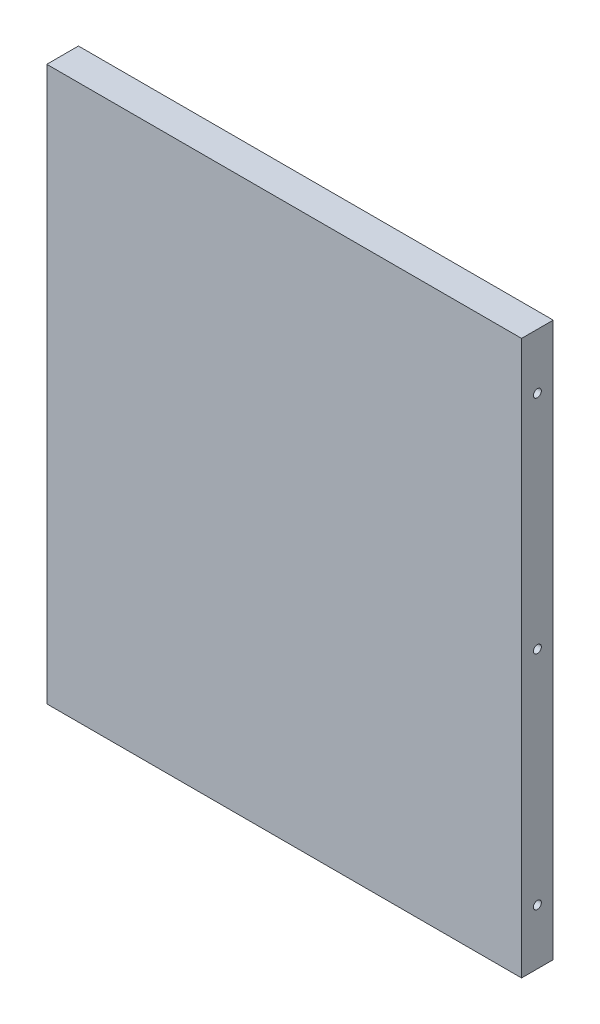
ISO-10303-21;
HEADER;
FILE_DESCRIPTION(('STEP AP214'),'2;1');
FILE_NAME('part.step','',(''),(''),'','','');
FILE_SCHEMA(('AUTOMOTIVE_DESIGN { 1 0 10303 214 1 1 1 1 }'));
ENDSEC;
DATA;
#1=APPLICATION_CONTEXT('core data for automotive mechanical design processes');
#2=APPLICATION_PROTOCOL_DEFINITION('international standard','automotive_design',2000,#1);
#3=PRODUCT_CONTEXT('',#1,'mechanical');
#4=PRODUCT('Part','Part','',(#3));
#5=PRODUCT_RELATED_PRODUCT_CATEGORY('part','',(#4));
#6=PRODUCT_DEFINITION_FORMATION('','',#4);
#7=PRODUCT_DEFINITION_CONTEXT('part definition',#1,'design');
#8=PRODUCT_DEFINITION('design','',#6,#7);
#9=PRODUCT_DEFINITION_SHAPE('','',#8);
#10=(LENGTH_UNIT() NAMED_UNIT(*) SI_UNIT(.MILLI.,.METRE.));
#11=(NAMED_UNIT(*) PLANE_ANGLE_UNIT() SI_UNIT($,.RADIAN.));
#12=(NAMED_UNIT(*) SI_UNIT($,.STERADIAN.) SOLID_ANGLE_UNIT());
#13=UNCERTAINTY_MEASURE_WITH_UNIT(LENGTH_MEASURE(1.E-05),#10,'distance_accuracy_value','');
#14=(GEOMETRIC_REPRESENTATION_CONTEXT(3) GLOBAL_UNCERTAINTY_ASSIGNED_CONTEXT((#13)) GLOBAL_UNIT_ASSIGNED_CONTEXT((#10,
#11,#12)) REPRESENTATION_CONTEXT('',''));
#15=CARTESIAN_POINT('',(0.,0.,0.));
#16=DIRECTION('',(0.,0.,1.));
#17=DIRECTION('',(1.,0.,0.));
#18=AXIS2_PLACEMENT_3D('',#15,#16,#17);
#19=CARTESIAN_POINT('',(-84.7009024495058,65.5769230769231,10.));
#20=DIRECTION('',(1.,0.,0.));
#21=DIRECTION('',(0.,1.,0.));
#22=AXIS2_PLACEMENT_3D('',#19,#20,#21);
#23=PLANE('',#22);
#24=CARTESIAN_POINT('',(-84.7009024495058,48.0769230769231,4.99999999999999));
#25=DIRECTION('',(-1.,0.,0.));
#26=DIRECTION('',(0.,-1.,0.));
#27=AXIS2_PLACEMENT_3D('',#24,#25,#26);
#28=CIRCLE('',#27,1.25);
#29=CARTESIAN_POINT('',(-84.7009024495058,46.8269230769231,4.99999999999999));
#30=VERTEX_POINT('',#29);
#31=EDGE_CURVE('E122',#30,#30,#28,.T.);
#32=ORIENTED_EDGE('',*,*,#31,.F.);
#33=EDGE_LOOP('',(#32));
#34=FACE_BOUND('',#33,.T.);
#35=CARTESIAN_POINT('',(-84.7009024495058,-21.9230769230769,5.));
#36=DIRECTION('',(-1.,0.,0.));
#37=DIRECTION('',(0.,-1.,0.));
#38=AXIS2_PLACEMENT_3D('',#35,#36,#37);
#39=CIRCLE('',#38,1.25);
#40=CARTESIAN_POINT('',(-84.7009024495058,-23.1730769230769,5.));
#41=VERTEX_POINT('',#40);
#42=EDGE_CURVE('E116',#41,#41,#39,.T.);
#43=ORIENTED_EDGE('',*,*,#42,.F.);
#44=EDGE_LOOP('',(#43));
#45=FACE_BOUND('',#44,.T.);
#46=CARTESIAN_POINT('',(-84.7009024495058,-91.9230769230769,4.99999999999999));
#47=DIRECTION('',(-1.,0.,0.));
#48=DIRECTION('',(0.,-1.,0.));
#49=AXIS2_PLACEMENT_3D('',#46,#47,#48);
#50=CIRCLE('',#49,1.25);
#51=CARTESIAN_POINT('',(-84.7009024495058,-93.1730769230769,4.99999999999999));
#52=VERTEX_POINT('',#51);
#53=EDGE_CURVE('E109',#52,#52,#50,.T.);
#54=ORIENTED_EDGE('',*,*,#53,.F.);
#55=EDGE_LOOP('',(#54));
#56=FACE_BOUND('',#55,.T.);
#57=DIRECTION('',(0.,-1.,0.));
#58=VECTOR('',#57,1.);
#59=CARTESIAN_POINT('',(-84.7009024495058,65.5769230769231,0.));
#60=LINE('',#59,#58);
#61=CARTESIAN_POINT('',(-84.7009024495058,65.5769230769231,0.));
#62=VERTEX_POINT('',#61);
#63=CARTESIAN_POINT('',(-84.7009024495058,-109.423076923077,0.));
#64=VERTEX_POINT('',#63);
#65=EDGE_CURVE('E95',#62,#64,#60,.T.);
#66=ORIENTED_EDGE('',*,*,#65,.T.);
#67=DIRECTION('',(0.,0.,-1.));
#68=VECTOR('',#67,1.);
#69=CARTESIAN_POINT('',(-84.7009024495058,-109.423076923077,10.));
#70=LINE('',#69,#68);
#71=CARTESIAN_POINT('',(-84.7009024495058,-109.423076923077,10.));
#72=VERTEX_POINT('',#71);
#73=EDGE_CURVE('E11',#72,#64,#70,.T.);
#74=ORIENTED_EDGE('',*,*,#73,.F.);
#75=DIRECTION('',(0.,-1.,0.));
#76=VECTOR('',#75,1.);
#77=CARTESIAN_POINT('',(-84.7009024495058,65.5769230769231,10.));
#78=LINE('',#77,#76);
#79=CARTESIAN_POINT('',(-84.7009024495058,65.5769230769231,10.));
#80=VERTEX_POINT('',#79);
#81=EDGE_CURVE('E83',#80,#72,#78,.T.);
#82=ORIENTED_EDGE('',*,*,#81,.F.);
#83=DIRECTION('',(0.,0.,-1.));
#84=VECTOR('',#83,1.);
#85=CARTESIAN_POINT('',(-84.7009024495058,65.5769230769231,10.));
#86=LINE('',#85,#84);
#87=EDGE_CURVE('E91',#80,#62,#86,.T.);
#88=ORIENTED_EDGE('',*,*,#87,.T.);
#89=EDGE_LOOP('',(#66,#74,#82,#88));
#90=FACE_BOUND('',#89,.T.);
#91=ADVANCED_FACE('F32',(#34,#45,#56,#90),#23,.F.);
#92=CARTESIAN_POINT('',(-84.7009024495058,-109.423076923077,10.));
#93=DIRECTION('',(0.,1.,0.));
#94=DIRECTION('',(0.,0.,1.));
#95=AXIS2_PLACEMENT_3D('',#92,#93,#94);
#96=PLANE('',#95);
#97=DIRECTION('',(1.,0.,0.));
#98=VECTOR('',#97,1.);
#99=CARTESIAN_POINT('',(-84.7009024495058,-109.423076923077,0.));
#100=LINE('',#99,#98);
#101=CARTESIAN_POINT('',(65.2990975504942,-109.423076923077,0.));
#102=VERTEX_POINT('',#101);
#103=EDGE_CURVE('E87',#64,#102,#100,.T.);
#104=ORIENTED_EDGE('',*,*,#103,.T.);
#105=DIRECTION('',(0.,0.,-1.));
#106=VECTOR('',#105,1.);
#107=CARTESIAN_POINT('',(65.2990975504942,-109.423076923077,10.));
#108=LINE('',#107,#106);
#109=CARTESIAN_POINT('',(65.2990975504942,-109.423076923077,10.));
#110=VERTEX_POINT('',#109);
#111=EDGE_CURVE('E40',#110,#102,#108,.T.);
#112=ORIENTED_EDGE('',*,*,#111,.F.);
#113=DIRECTION('',(1.,0.,0.));
#114=VECTOR('',#113,1.);
#115=CARTESIAN_POINT('',(-84.7009024495058,-109.423076923077,10.));
#116=LINE('',#115,#114);
#117=EDGE_CURVE('E78',#72,#110,#116,.T.);
#118=ORIENTED_EDGE('',*,*,#117,.F.);
#119=ORIENTED_EDGE('',*,*,#73,.T.);
#120=EDGE_LOOP('',(#104,#112,#118,#119));
#121=FACE_BOUND('',#120,.T.);
#122=ADVANCED_FACE('F86',(#121),#96,.F.);
#123=CARTESIAN_POINT('',(65.2990975504942,65.5769230769231,10.));
#124=DIRECTION('',(-1.,0.,0.));
#125=DIRECTION('',(0.,-1.,0.));
#126=AXIS2_PLACEMENT_3D('',#123,#124,#125);
#127=PLANE('',#126);
#128=CARTESIAN_POINT('',(65.2990975504942,48.0769230769231,5.));
#129=DIRECTION('',(1.,0.,0.));
#130=DIRECTION('',(0.,1.,0.));
#131=AXIS2_PLACEMENT_3D('',#128,#129,#130);
#132=CIRCLE('',#131,1.25);
#133=CARTESIAN_POINT('',(65.2990975504942,49.3269230769231,5.));
#134=VERTEX_POINT('',#133);
#135=EDGE_CURVE('E139',#134,#134,#132,.T.);
#136=ORIENTED_EDGE('',*,*,#135,.F.);
#137=EDGE_LOOP('',(#136));
#138=FACE_BOUND('',#137,.T.);
#139=CARTESIAN_POINT('',(65.2990975504942,-21.9230769230769,5.));
#140=DIRECTION('',(1.,0.,0.));
#141=DIRECTION('',(0.,1.,0.));
#142=AXIS2_PLACEMENT_3D('',#139,#140,#141);
#143=CIRCLE('',#142,1.25);
#144=CARTESIAN_POINT('',(65.2990975504942,-20.6730769230769,5.));
#145=VERTEX_POINT('',#144);
#146=EDGE_CURVE('E133',#145,#145,#143,.T.);
#147=ORIENTED_EDGE('',*,*,#146,.F.);
#148=EDGE_LOOP('',(#147));
#149=FACE_BOUND('',#148,.T.);
#150=CARTESIAN_POINT('',(65.2990975504942,-91.9230769230769,5.));
#151=DIRECTION('',(1.,0.,0.));
#152=DIRECTION('',(0.,1.,0.));
#153=AXIS2_PLACEMENT_3D('',#150,#151,#152);
#154=CIRCLE('',#153,1.25);
#155=CARTESIAN_POINT('',(65.2990975504942,-90.6730769230769,5.));
#156=VERTEX_POINT('',#155);
#157=EDGE_CURVE('E127',#156,#156,#154,.T.);
#158=ORIENTED_EDGE('',*,*,#157,.F.);
#159=EDGE_LOOP('',(#158));
#160=FACE_BOUND('',#159,.T.);
#161=DIRECTION('',(0.,1.,0.));
#162=VECTOR('',#161,1.);
#163=CARTESIAN_POINT('',(65.2990975504942,65.5769230769231,0.));
#164=LINE('',#163,#162);
#165=CARTESIAN_POINT('',(65.2990975504942,65.5769230769231,0.));
#166=VERTEX_POINT('',#165);
#167=EDGE_CURVE('E65',#102,#166,#164,.T.);
#168=ORIENTED_EDGE('',*,*,#167,.T.);
#169=DIRECTION('',(0.,0.,-1.));
#170=VECTOR('',#169,1.);
#171=CARTESIAN_POINT('',(65.2990975504942,65.5769230769231,10.));
#172=LINE('',#171,#170);
#173=CARTESIAN_POINT('',(65.2990975504942,65.5769230769231,10.));
#174=VERTEX_POINT('',#173);
#175=EDGE_CURVE('E88',#174,#166,#172,.T.);
#176=ORIENTED_EDGE('',*,*,#175,.F.);
#177=DIRECTION('',(0.,1.,0.));
#178=VECTOR('',#177,1.);
#179=CARTESIAN_POINT('',(65.2990975504942,65.5769230769231,10.));
#180=LINE('',#179,#178);
#181=EDGE_CURVE('E81',#110,#174,#180,.T.);
#182=ORIENTED_EDGE('',*,*,#181,.F.);
#183=ORIENTED_EDGE('',*,*,#111,.T.);
#184=EDGE_LOOP('',(#168,#176,#182,#183));
#185=FACE_BOUND('',#184,.T.);
#186=ADVANCED_FACE('F89',(#138,#149,#160,#185),#127,.F.);
#187=CARTESIAN_POINT('',(-84.7009024495058,65.5769230769231,10.));
#188=DIRECTION('',(0.,-1.,0.));
#189=DIRECTION('',(0.,0.,-1.));
#190=AXIS2_PLACEMENT_3D('',#187,#188,#189);
#191=PLANE('',#190);
#192=DIRECTION('',(-1.,0.,0.));
#193=VECTOR('',#192,1.);
#194=CARTESIAN_POINT('',(-84.7009024495058,65.5769230769231,0.));
#195=LINE('',#194,#193);
#196=EDGE_CURVE('E71',#166,#62,#195,.T.);
#197=ORIENTED_EDGE('',*,*,#196,.T.);
#198=ORIENTED_EDGE('',*,*,#87,.F.);
#199=DIRECTION('',(-1.,0.,0.));
#200=VECTOR('',#199,1.);
#201=CARTESIAN_POINT('',(-84.7009024495058,65.5769230769231,10.));
#202=LINE('',#201,#200);
#203=EDGE_CURVE('E48',#174,#80,#202,.T.);
#204=ORIENTED_EDGE('',*,*,#203,.F.);
#205=ORIENTED_EDGE('',*,*,#175,.T.);
#206=EDGE_LOOP('',(#197,#198,#204,#205));
#207=FACE_BOUND('',#206,.T.);
#208=ADVANCED_FACE('F103',(#207),#191,.F.);
#209=CARTESIAN_POINT('',(0.,0.,10.));
#210=DIRECTION('',(0.,0.,1.));
#211=DIRECTION('',(1.,0.,0.));
#212=AXIS2_PLACEMENT_3D('',#209,#210,#211);
#213=PLANE('',#212);
#214=ORIENTED_EDGE('',*,*,#81,.T.);
#215=ORIENTED_EDGE('',*,*,#117,.T.);
#216=ORIENTED_EDGE('',*,*,#181,.T.);
#217=ORIENTED_EDGE('',*,*,#203,.T.);
#218=EDGE_LOOP('',(#214,#215,#216,#217));
#219=FACE_BOUND('',#218,.T.);
#220=ADVANCED_FACE('F79',(#219),#213,.T.);
#221=CARTESIAN_POINT('',(0.,0.,0.));
#222=DIRECTION('',(0.,0.,1.));
#223=DIRECTION('',(1.,0.,0.));
#224=AXIS2_PLACEMENT_3D('',#221,#222,#223);
#225=PLANE('',#224);
#226=ORIENTED_EDGE('',*,*,#65,.F.);
#227=ORIENTED_EDGE('',*,*,#196,.F.);
#228=ORIENTED_EDGE('',*,*,#167,.F.);
#229=ORIENTED_EDGE('',*,*,#103,.F.);
#230=EDGE_LOOP('',(#226,#227,#228,#229));
#231=FACE_BOUND('',#230,.T.);
#232=ADVANCED_FACE('F106',(#231),#225,.F.);
#233=CARTESIAN_POINT('',(-79.7009024495058,-91.9230769230769,4.99999999999999));
#234=DIRECTION('',(-1.,0.,0.));
#235=DIRECTION('',(0.,-1.,0.));
#236=AXIS2_PLACEMENT_3D('',#233,#234,#235);
#237=CYLINDRICAL_SURFACE('',#236,1.25);
#238=CARTESIAN_POINT('',(-79.7009024495058,-91.9230769230769,4.99999999999999));
#239=DIRECTION('',(-1.,0.,0.));
#240=DIRECTION('',(0.,-1.,0.));
#241=AXIS2_PLACEMENT_3D('',#238,#239,#240);
#242=CIRCLE('',#241,1.25);
#243=CARTESIAN_POINT('',(-79.7009024495058,-93.1730769230769,4.99999999999999));
#244=VERTEX_POINT('',#243);
#245=EDGE_CURVE('E112',#244,#244,#242,.T.);
#246=ORIENTED_EDGE('',*,*,#245,.F.);
#247=EDGE_LOOP('',(#246));
#248=FACE_BOUND('',#247,.T.);
#249=ORIENTED_EDGE('',*,*,#53,.T.);
#250=EDGE_LOOP('',(#249));
#251=FACE_BOUND('',#250,.T.);
#252=ADVANCED_FACE('F191',(#248,#251),#237,.F.);
#253=CARTESIAN_POINT('',(-79.7009024495058,-91.9230769230769,4.99999999999999));
#254=DIRECTION('',(-1.,0.,0.));
#255=DIRECTION('',(0.,-1.,0.));
#256=AXIS2_PLACEMENT_3D('',#253,#254,#255);
#257=PLANE('',#256);
#258=ORIENTED_EDGE('',*,*,#245,.T.);
#259=EDGE_LOOP('',(#258));
#260=FACE_BOUND('',#259,.T.);
#261=ADVANCED_FACE('F193',(#260),#257,.T.);
#262=CARTESIAN_POINT('',(-79.7009024495058,-21.9230769230769,5.));
#263=DIRECTION('',(-1.,0.,0.));
#264=DIRECTION('',(0.,-1.,0.));
#265=AXIS2_PLACEMENT_3D('',#262,#263,#264);
#266=CYLINDRICAL_SURFACE('',#265,1.25);
#267=CARTESIAN_POINT('',(-79.7009024495058,-21.9230769230769,5.));
#268=DIRECTION('',(-1.,0.,0.));
#269=DIRECTION('',(0.,-1.,0.));
#270=AXIS2_PLACEMENT_3D('',#267,#268,#269);
#271=CIRCLE('',#270,1.25);
#272=CARTESIAN_POINT('',(-79.7009024495058,-23.1730769230769,5.));
#273=VERTEX_POINT('',#272);
#274=EDGE_CURVE('E119',#273,#273,#271,.T.);
#275=ORIENTED_EDGE('',*,*,#274,.F.);
#276=EDGE_LOOP('',(#275));
#277=FACE_BOUND('',#276,.T.);
#278=ORIENTED_EDGE('',*,*,#42,.T.);
#279=EDGE_LOOP('',(#278));
#280=FACE_BOUND('',#279,.T.);
#281=ADVANCED_FACE('F199',(#277,#280),#266,.F.);
#282=CARTESIAN_POINT('',(-79.7009024495058,-21.9230769230769,5.));
#283=DIRECTION('',(-1.,0.,0.));
#284=DIRECTION('',(0.,-1.,0.));
#285=AXIS2_PLACEMENT_3D('',#282,#283,#284);
#286=PLANE('',#285);
#287=ORIENTED_EDGE('',*,*,#274,.T.);
#288=EDGE_LOOP('',(#287));
#289=FACE_BOUND('',#288,.T.);
#290=ADVANCED_FACE('F243',(#289),#286,.T.);
#291=CARTESIAN_POINT('',(-79.7009024495058,48.0769230769231,4.99999999999999));
#292=DIRECTION('',(-1.,0.,0.));
#293=DIRECTION('',(0.,-1.,0.));
#294=AXIS2_PLACEMENT_3D('',#291,#292,#293);
#295=CYLINDRICAL_SURFACE('',#294,1.25);
#296=CARTESIAN_POINT('',(-79.7009024495058,48.0769230769231,4.99999999999999));
#297=DIRECTION('',(-1.,0.,0.));
#298=DIRECTION('',(0.,-1.,0.));
#299=AXIS2_PLACEMENT_3D('',#296,#297,#298);
#300=CIRCLE('',#299,1.25);
#301=CARTESIAN_POINT('',(-79.7009024495058,46.8269230769231,4.99999999999999));
#302=VERTEX_POINT('',#301);
#303=EDGE_CURVE('E98',#302,#302,#300,.T.);
#304=ORIENTED_EDGE('',*,*,#303,.F.);
#305=EDGE_LOOP('',(#304));
#306=FACE_BOUND('',#305,.T.);
#307=ORIENTED_EDGE('',*,*,#31,.T.);
#308=EDGE_LOOP('',(#307));
#309=FACE_BOUND('',#308,.T.);
#310=ADVANCED_FACE('F174',(#306,#309),#295,.F.);
#311=CARTESIAN_POINT('',(-79.7009024495058,48.0769230769231,4.99999999999999));
#312=DIRECTION('',(-1.,0.,0.));
#313=DIRECTION('',(0.,-1.,0.));
#314=AXIS2_PLACEMENT_3D('',#311,#312,#313);
#315=PLANE('',#314);
#316=ORIENTED_EDGE('',*,*,#303,.T.);
#317=EDGE_LOOP('',(#316));
#318=FACE_BOUND('',#317,.T.);
#319=ADVANCED_FACE('F164',(#318),#315,.T.);
#320=CARTESIAN_POINT('',(60.2990975504942,-91.9230769230769,5.));
#321=DIRECTION('',(1.,0.,0.));
#322=DIRECTION('',(0.,1.,0.));
#323=AXIS2_PLACEMENT_3D('',#320,#321,#322);
#324=CYLINDRICAL_SURFACE('',#323,1.25);
#325=CARTESIAN_POINT('',(60.2990975504942,-91.9230769230769,5.));
#326=DIRECTION('',(1.,0.,0.));
#327=DIRECTION('',(0.,1.,0.));
#328=AXIS2_PLACEMENT_3D('',#325,#326,#327);
#329=CIRCLE('',#328,1.25);
#330=CARTESIAN_POINT('',(60.2990975504942,-90.6730769230769,5.));
#331=VERTEX_POINT('',#330);
#332=EDGE_CURVE('E130',#331,#331,#329,.T.);
#333=ORIENTED_EDGE('',*,*,#332,.F.);
#334=EDGE_LOOP('',(#333));
#335=FACE_BOUND('',#334,.T.);
#336=ORIENTED_EDGE('',*,*,#157,.T.);
#337=EDGE_LOOP('',(#336));
#338=FACE_BOUND('',#337,.T.);
#339=ADVANCED_FACE('F161',(#335,#338),#324,.F.);
#340=CARTESIAN_POINT('',(60.2990975504942,-91.9230769230769,5.));
#341=DIRECTION('',(1.,0.,0.));
#342=DIRECTION('',(0.,1.,0.));
#343=AXIS2_PLACEMENT_3D('',#340,#341,#342);
#344=PLANE('',#343);
#345=ORIENTED_EDGE('',*,*,#332,.T.);
#346=EDGE_LOOP('',(#345));
#347=FACE_BOUND('',#346,.T.);
#348=ADVANCED_FACE('F163',(#347),#344,.T.);
#349=CARTESIAN_POINT('',(60.2990975504942,-21.9230769230769,5.));
#350=DIRECTION('',(1.,0.,0.));
#351=DIRECTION('',(0.,1.,0.));
#352=AXIS2_PLACEMENT_3D('',#349,#350,#351);
#353=CYLINDRICAL_SURFACE('',#352,1.25);
#354=CARTESIAN_POINT('',(60.2990975504942,-21.9230769230769,5.));
#355=DIRECTION('',(1.,0.,0.));
#356=DIRECTION('',(0.,1.,0.));
#357=AXIS2_PLACEMENT_3D('',#354,#355,#356);
#358=CIRCLE('',#357,1.25);
#359=CARTESIAN_POINT('',(60.2990975504942,-20.6730769230769,5.));
#360=VERTEX_POINT('',#359);
#361=EDGE_CURVE('E136',#360,#360,#358,.T.);
#362=ORIENTED_EDGE('',*,*,#361,.F.);
#363=EDGE_LOOP('',(#362));
#364=FACE_BOUND('',#363,.T.);
#365=ORIENTED_EDGE('',*,*,#146,.T.);
#366=EDGE_LOOP('',(#365));
#367=FACE_BOUND('',#366,.T.);
#368=ADVANCED_FACE('F171',(#364,#367),#353,.F.);
#369=CARTESIAN_POINT('',(60.2990975504942,-21.9230769230769,5.));
#370=DIRECTION('',(1.,0.,0.));
#371=DIRECTION('',(0.,1.,0.));
#372=AXIS2_PLACEMENT_3D('',#369,#370,#371);
#373=PLANE('',#372);
#374=ORIENTED_EDGE('',*,*,#361,.T.);
#375=EDGE_LOOP('',(#374));
#376=FACE_BOUND('',#375,.T.);
#377=ADVANCED_FACE('F150',(#376),#373,.T.);
#378=CARTESIAN_POINT('',(60.2990975504942,48.0769230769231,5.));
#379=DIRECTION('',(1.,0.,0.));
#380=DIRECTION('',(0.,1.,0.));
#381=AXIS2_PLACEMENT_3D('',#378,#379,#380);
#382=CYLINDRICAL_SURFACE('',#381,1.25);
#383=CARTESIAN_POINT('',(60.2990975504942,48.0769230769231,5.));
#384=DIRECTION('',(1.,0.,0.));
#385=DIRECTION('',(0.,1.,0.));
#386=AXIS2_PLACEMENT_3D('',#383,#384,#385);
#387=CIRCLE('',#386,1.25);
#388=CARTESIAN_POINT('',(60.2990975504942,49.3269230769231,5.));
#389=VERTEX_POINT('',#388);
#390=EDGE_CURVE('E113',#389,#389,#387,.T.);
#391=ORIENTED_EDGE('',*,*,#390,.F.);
#392=EDGE_LOOP('',(#391));
#393=FACE_BOUND('',#392,.T.);
#394=ORIENTED_EDGE('',*,*,#135,.T.);
#395=EDGE_LOOP('',(#394));
#396=FACE_BOUND('',#395,.T.);
#397=ADVANCED_FACE('F147',(#393,#396),#382,.F.);
#398=CARTESIAN_POINT('',(60.2990975504942,48.0769230769231,5.));
#399=DIRECTION('',(1.,0.,0.));
#400=DIRECTION('',(0.,1.,0.));
#401=AXIS2_PLACEMENT_3D('',#398,#399,#400);
#402=PLANE('',#401);
#403=ORIENTED_EDGE('',*,*,#390,.T.);
#404=EDGE_LOOP('',(#403));
#405=FACE_BOUND('',#404,.T.);
#406=ADVANCED_FACE('F145',(#405),#402,.T.);
#407=CLOSED_SHELL('',(#91,#122,#186,#208,#220,#232,#252,#261,#281,#290,#310,#319,#339,#348,#368,
#377,#397,#406));
#408=MANIFOLD_SOLID_BREP('B2',#407);
#409=ADVANCED_BREP_SHAPE_REPRESENTATION('',(#18,#408),#14);
#410=SHAPE_DEFINITION_REPRESENTATION(#9,#409);
ENDSEC;
END-ISO-10303-21;
